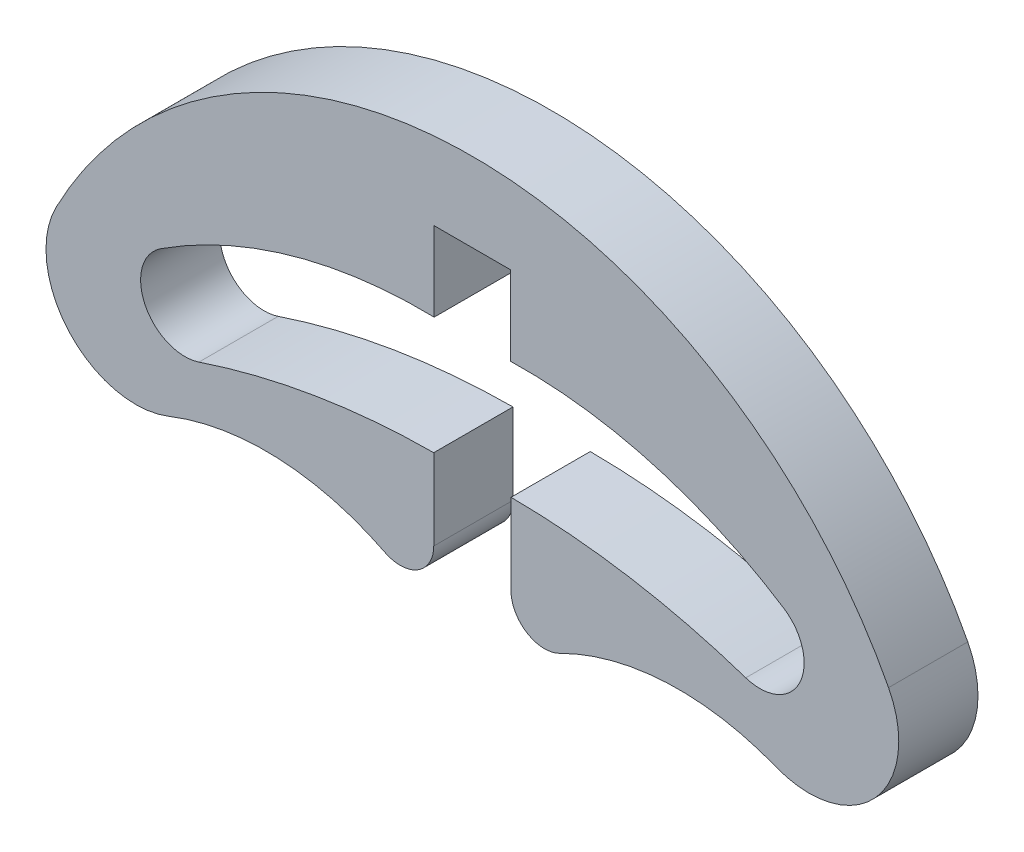
ISO-10303-21;
HEADER;
FILE_DESCRIPTION(('STEP AP214'),'2;1');
FILE_NAME('part.step','',(''),(''),'','','');
FILE_SCHEMA(('AUTOMOTIVE_DESIGN { 1 0 10303 214 1 1 1 1 }'));
ENDSEC;
DATA;
#1=APPLICATION_CONTEXT('core data for automotive mechanical design processes');
#2=APPLICATION_PROTOCOL_DEFINITION('international standard','automotive_design',2000,#1);
#3=PRODUCT_CONTEXT('',#1,'mechanical');
#4=PRODUCT('Part','Part','',(#3));
#5=PRODUCT_RELATED_PRODUCT_CATEGORY('part','',(#4));
#6=PRODUCT_DEFINITION_FORMATION('','',#4);
#7=PRODUCT_DEFINITION_CONTEXT('part definition',#1,'design');
#8=PRODUCT_DEFINITION('design','',#6,#7);
#9=PRODUCT_DEFINITION_SHAPE('','',#8);
#10=(LENGTH_UNIT() NAMED_UNIT(*) SI_UNIT(.MILLI.,.METRE.));
#11=(NAMED_UNIT(*) PLANE_ANGLE_UNIT() SI_UNIT($,.RADIAN.));
#12=(NAMED_UNIT(*) SI_UNIT($,.STERADIAN.) SOLID_ANGLE_UNIT());
#13=UNCERTAINTY_MEASURE_WITH_UNIT(LENGTH_MEASURE(1.E-05),#10,'distance_accuracy_value','');
#14=(GEOMETRIC_REPRESENTATION_CONTEXT(3) GLOBAL_UNCERTAINTY_ASSIGNED_CONTEXT((#13)) GLOBAL_UNIT_ASSIGNED_CONTEXT((#10,
#11,#12)) REPRESENTATION_CONTEXT('',''));
#15=CARTESIAN_POINT('',(0.,0.,0.));
#16=DIRECTION('',(0.,0.,1.));
#17=DIRECTION('',(1.,0.,0.));
#18=AXIS2_PLACEMENT_3D('',#15,#16,#17);
#19=CARTESIAN_POINT('',(1.4475,2.128,3.));
#20=DIRECTION('',(1.,0.,0.));
#21=DIRECTION('',(0.,0.,-1.));
#22=AXIS2_PLACEMENT_3D('',#19,#20,#21);
#23=PLANE('',#22);
#24=DIRECTION('',(0.,-1.,0.));
#25=VECTOR('',#24,1.);
#26=CARTESIAN_POINT('',(1.4475,2.128,0.));
#27=LINE('',#26,#25);
#28=CARTESIAN_POINT('',(1.4475,5.128,0.));
#29=VERTEX_POINT('',#28);
#30=CARTESIAN_POINT('',(1.4475,2.128,0.));
#31=VERTEX_POINT('',#30);
#32=EDGE_CURVE('E296',#29,#31,#27,.T.);
#33=ORIENTED_EDGE('',*,*,#32,.T.);
#34=DIRECTION('',(0.,0.,-1.));
#35=VECTOR('',#34,1.);
#36=CARTESIAN_POINT('',(1.4475,2.128,3.));
#37=LINE('',#36,#35);
#38=CARTESIAN_POINT('',(1.4475,2.128,3.));
#39=VERTEX_POINT('',#38);
#40=EDGE_CURVE('E185',#39,#31,#37,.T.);
#41=ORIENTED_EDGE('',*,*,#40,.F.);
#42=DIRECTION('',(0.,-1.,0.));
#43=VECTOR('',#42,1.);
#44=CARTESIAN_POINT('',(1.4475,2.128,3.));
#45=LINE('',#44,#43);
#46=CARTESIAN_POINT('',(1.4475,5.128,3.));
#47=VERTEX_POINT('',#46);
#48=EDGE_CURVE('E215',#47,#39,#45,.T.);
#49=ORIENTED_EDGE('',*,*,#48,.F.);
#50=DIRECTION('',(0.,0.,-1.));
#51=VECTOR('',#50,1.);
#52=CARTESIAN_POINT('',(1.4475,5.128,3.));
#53=LINE('',#52,#51);
#54=EDGE_CURVE('E214',#47,#29,#53,.T.);
#55=ORIENTED_EDGE('',*,*,#54,.T.);
#56=EDGE_LOOP('',(#33,#41,#49,#55));
#57=FACE_BOUND('',#56,.T.);
#58=ADVANCED_FACE('F48',(#57),#23,.F.);
#59=CARTESIAN_POINT('',(1.88377801092289,-16.0788129173373,3.));
#60=DIRECTION('',(0.,0.,-1.));
#61=DIRECTION('',(-1.,0.,0.));
#62=AXIS2_PLACEMENT_3D('',#59,#60,#61);
#63=CYLINDRICAL_SURFACE('',#62,18.2120392902534);
#64=CARTESIAN_POINT('',(1.88377801092289,-16.0788129173373,0.));
#65=DIRECTION('',(0.,0.,-1.));
#66=DIRECTION('',(-1.,0.,0.));
#67=AXIS2_PLACEMENT_3D('',#64,#65,#66);
#68=CIRCLE('',#67,18.2120392902534);
#69=CARTESIAN_POINT('',(11.7968695966124,-0.801084345214188,0.));
#70=VERTEX_POINT('',#69);
#71=EDGE_CURVE('E325',#31,#70,#68,.T.);
#72=ORIENTED_EDGE('',*,*,#71,.T.);
#73=DIRECTION('',(0.,0.,-1.));
#74=VECTOR('',#73,1.);
#75=CARTESIAN_POINT('',(11.7968695966124,-0.801084345214188,3.));
#76=LINE('',#75,#74);
#77=CARTESIAN_POINT('',(11.7968695966124,-0.801084345214188,3.));
#78=VERTEX_POINT('',#77);
#79=EDGE_CURVE('E243',#78,#70,#76,.T.);
#80=ORIENTED_EDGE('',*,*,#79,.F.);
#81=CARTESIAN_POINT('',(1.88377801092289,-16.0788129173373,3.));
#82=DIRECTION('',(0.,0.,-1.));
#83=DIRECTION('',(-1.,0.,0.));
#84=AXIS2_PLACEMENT_3D('',#81,#82,#83);
#85=CIRCLE('',#84,18.2120392902534);
#86=EDGE_CURVE('E305',#39,#78,#85,.T.);
#87=ORIENTED_EDGE('',*,*,#86,.F.);
#88=ORIENTED_EDGE('',*,*,#40,.T.);
#89=EDGE_LOOP('',(#72,#80,#87,#88));
#90=FACE_BOUND('',#89,.T.);
#91=ADVANCED_FACE('F322',(#90),#63,.F.);
#92=CARTESIAN_POINT('',(10.8843878252639,-2.20737104287746,3.));
#93=DIRECTION('',(0.,0.,-1.));
#94=DIRECTION('',(-1.,0.,0.));
#95=AXIS2_PLACEMENT_3D('',#92,#93,#94);
#96=CYLINDRICAL_SURFACE('',#95,1.6763845797036);
#97=CARTESIAN_POINT('',(10.8843878252639,-2.20737104287746,0.));
#98=DIRECTION('',(0.,0.,-1.));
#99=DIRECTION('',(-1.,0.,0.));
#100=AXIS2_PLACEMENT_3D('',#97,#98,#99);
#101=CIRCLE('',#100,1.6763845797036);
#102=CARTESIAN_POINT('',(10.3516059251626,-3.79683910043397,0.));
#103=VERTEX_POINT('',#102);
#104=EDGE_CURVE('E330',#70,#103,#101,.T.);
#105=ORIENTED_EDGE('',*,*,#104,.T.);
#106=DIRECTION('',(0.,0.,-1.));
#107=VECTOR('',#106,1.);
#108=CARTESIAN_POINT('',(10.3516059251626,-3.79683910043397,3.));
#109=LINE('',#108,#107);
#110=CARTESIAN_POINT('',(10.3516059251626,-3.79683910043397,3.));
#111=VERTEX_POINT('',#110);
#112=EDGE_CURVE('E239',#111,#103,#109,.T.);
#113=ORIENTED_EDGE('',*,*,#112,.F.);
#114=CARTESIAN_POINT('',(10.8843878252639,-2.20737104287746,3.));
#115=DIRECTION('',(0.,0.,-1.));
#116=DIRECTION('',(-1.,0.,0.));
#117=AXIS2_PLACEMENT_3D('',#114,#115,#116);
#118=CIRCLE('',#117,1.6763845797036);
#119=EDGE_CURVE('E309',#78,#111,#118,.T.);
#120=ORIENTED_EDGE('',*,*,#119,.F.);
#121=ORIENTED_EDGE('',*,*,#79,.T.);
#122=EDGE_LOOP('',(#105,#113,#120,#121));
#123=FACE_BOUND('',#122,.T.);
#124=ADVANCED_FACE('F323',(#123),#96,.F.);
#125=CARTESIAN_POINT('',(1.31160144117613,-30.7662206892842,3.));
#126=DIRECTION('',(0.,0.,-1.));
#127=DIRECTION('',(-1.,0.,0.));
#128=AXIS2_PLACEMENT_3D('',#125,#126,#127);
#129=CYLINDRICAL_SURFACE('',#128,28.4441421799904);
#130=CARTESIAN_POINT('',(1.31160144117613,-30.7662206892842,0.));
#131=DIRECTION('',(0.,0.,1.));
#132=DIRECTION('',(1.,0.,0.));
#133=AXIS2_PLACEMENT_3D('',#130,#131,#132);
#134=CIRCLE('',#133,28.4441421799904);
#135=CARTESIAN_POINT('',(1.4625,-2.32247877686251,0.));
#136=VERTEX_POINT('',#135);
#137=EDGE_CURVE('E365',#103,#136,#134,.T.);
#138=ORIENTED_EDGE('',*,*,#137,.T.);
#139=DIRECTION('',(0.,0.,-1.));
#140=VECTOR('',#139,1.);
#141=CARTESIAN_POINT('',(1.4625,-2.32247877686251,3.));
#142=LINE('',#141,#140);
#143=CARTESIAN_POINT('',(1.4625,-2.32247877686251,3.));
#144=VERTEX_POINT('',#143);
#145=EDGE_CURVE('E192',#136,#144,#142,.F.);
#146=ORIENTED_EDGE('',*,*,#145,.T.);
#147=CARTESIAN_POINT('',(1.31160144117613,-30.7662206892842,3.));
#148=DIRECTION('',(0.,0.,1.));
#149=DIRECTION('',(1.,0.,0.));
#150=AXIS2_PLACEMENT_3D('',#147,#148,#149);
#151=CIRCLE('',#150,28.4441421799904);
#152=EDGE_CURVE('E266',#111,#144,#151,.T.);
#153=ORIENTED_EDGE('',*,*,#152,.F.);
#154=ORIENTED_EDGE('',*,*,#112,.T.);
#155=EDGE_LOOP('',(#138,#146,#153,#154));
#156=FACE_BOUND('',#155,.T.);
#157=ADVANCED_FACE('F333',(#156),#129,.T.);
#158=CARTESIAN_POINT('',(7.81556828426179,-15.4545559716848,3.));
#159=DIRECTION('',(0.,0.,-1.));
#160=DIRECTION('',(-1.,0.,0.));
#161=AXIS2_PLACEMENT_3D('',#158,#159,#160);
#162=CYLINDRICAL_SURFACE('',#161,10.0102465106841);
#163=CARTESIAN_POINT('',(7.81556828426179,-15.4545559716848,3.));
#164=DIRECTION('',(0.,0.,-1.));
#165=DIRECTION('',(1.,0.,0.));
#166=AXIS2_PLACEMENT_3D('',#163,#164,#165);
#167=CIRCLE('',#166,10.0102465106841);
#168=CARTESIAN_POINT('',(3.3047833020447,-6.51823379481208,3.));
#169=VERTEX_POINT('',#168);
#170=CARTESIAN_POINT('',(11.4981830857403,-6.1463132036542,3.));
#171=VERTEX_POINT('',#170);
#172=EDGE_CURVE('E268',#169,#171,#167,.T.);
#173=ORIENTED_EDGE('',*,*,#172,.F.);
#174=DIRECTION('',(0.,0.,-1.));
#175=VECTOR('',#174,1.);
#176=CARTESIAN_POINT('',(3.3047833020447,-6.51823379481207,3.));
#177=LINE('',#176,#175);
#178=CARTESIAN_POINT('',(3.3047833020447,-6.51823379481208,0.));
#179=VERTEX_POINT('',#178);
#180=EDGE_CURVE('E57',#169,#179,#177,.T.);
#181=ORIENTED_EDGE('',*,*,#180,.T.);
#182=CARTESIAN_POINT('',(7.81556828426179,-15.4545559716848,0.));
#183=DIRECTION('',(0.,0.,-1.));
#184=DIRECTION('',(1.,0.,0.));
#185=AXIS2_PLACEMENT_3D('',#182,#183,#184);
#186=CIRCLE('',#185,10.0102465106841);
#187=CARTESIAN_POINT('',(11.4981830857403,-6.1463132036542,0.));
#188=VERTEX_POINT('',#187);
#189=EDGE_CURVE('E359',#179,#188,#186,.T.);
#190=ORIENTED_EDGE('',*,*,#189,.T.);
#191=DIRECTION('',(0.,0.,-1.));
#192=VECTOR('',#191,1.);
#193=CARTESIAN_POINT('',(11.4981830857403,-6.1463132036542,3.));
#194=LINE('',#193,#192);
#195=EDGE_CURVE('E240',#171,#188,#194,.T.);
#196=ORIENTED_EDGE('',*,*,#195,.F.);
#197=EDGE_LOOP('',(#173,#181,#190,#196));
#198=FACE_BOUND('',#197,.T.);
#199=ADVANCED_FACE('F419',(#198),#162,.F.);
#200=CARTESIAN_POINT('',(12.7473489068736,-2.98889942365009,3.));
#201=DIRECTION('',(0.,0.,-1.));
#202=DIRECTION('',(-1.,0.,0.));
#203=AXIS2_PLACEMENT_3D('',#200,#201,#202);
#204=CYLINDRICAL_SURFACE('',#203,3.39553781113501);
#205=CARTESIAN_POINT('',(12.7473489068736,-2.98889942365009,0.));
#206=DIRECTION('',(0.,0.,1.));
#207=DIRECTION('',(-1.,0.,0.));
#208=AXIS2_PLACEMENT_3D('',#205,#206,#207);
#209=CIRCLE('',#208,3.39553781113501);
#210=CARTESIAN_POINT('',(15.7567200663857,-1.41620674828577,0.));
#211=VERTEX_POINT('',#210);
#212=EDGE_CURVE('E351',#188,#211,#209,.T.);
#213=ORIENTED_EDGE('',*,*,#212,.T.);
#214=DIRECTION('',(0.,0.,-1.));
#215=VECTOR('',#214,1.);
#216=CARTESIAN_POINT('',(15.7567200663857,-1.41620674828577,3.));
#217=LINE('',#216,#215);
#218=CARTESIAN_POINT('',(15.7567200663857,-1.41620674828577,3.));
#219=VERTEX_POINT('',#218);
#220=EDGE_CURVE('E234',#219,#211,#217,.T.);
#221=ORIENTED_EDGE('',*,*,#220,.F.);
#222=CARTESIAN_POINT('',(12.7473489068736,-2.98889942365009,3.));
#223=DIRECTION('',(0.,0.,1.));
#224=DIRECTION('',(-1.,0.,0.));
#225=AXIS2_PLACEMENT_3D('',#222,#223,#224);
#226=CIRCLE('',#225,3.39553781113501);
#227=EDGE_CURVE('E270',#171,#219,#226,.T.);
#228=ORIENTED_EDGE('',*,*,#227,.F.);
#229=ORIENTED_EDGE('',*,*,#195,.T.);
#230=EDGE_LOOP('',(#213,#221,#228,#229));
#231=FACE_BOUND('',#230,.T.);
#232=ADVANCED_FACE('F416',(#231),#204,.T.);
#233=CARTESIAN_POINT('',(0.,-9.65064408508431,3.));
#234=DIRECTION('',(0.,0.,-1.));
#235=DIRECTION('',(-1.,0.,0.));
#236=AXIS2_PLACEMENT_3D('',#233,#234,#235);
#237=CYLINDRICAL_SURFACE('',#236,17.7786440850843);
#238=CARTESIAN_POINT('',(0.,-9.65064408508431,0.));
#239=DIRECTION('',(0.,0.,1.));
#240=DIRECTION('',(1.,0.,0.));
#241=AXIS2_PLACEMENT_3D('',#238,#239,#240);
#242=CIRCLE('',#241,17.7786440850843);
#243=CARTESIAN_POINT('',(-15.7567200663857,-1.41620674828577,0.));
#244=VERTEX_POINT('',#243);
#245=EDGE_CURVE('E355',#211,#244,#242,.T.);
#246=ORIENTED_EDGE('',*,*,#245,.T.);
#247=DIRECTION('',(0.,0.,-1.));
#248=VECTOR('',#247,1.);
#249=CARTESIAN_POINT('',(-15.7567200663857,-1.41620674828577,3.));
#250=LINE('',#249,#248);
#251=CARTESIAN_POINT('',(-15.7567200663857,-1.41620674828577,3.));
#252=VERTEX_POINT('',#251);
#253=EDGE_CURVE('E233',#252,#244,#250,.T.);
#254=ORIENTED_EDGE('',*,*,#253,.F.);
#255=CARTESIAN_POINT('',(0.,-9.65064408508431,3.));
#256=DIRECTION('',(0.,0.,1.));
#257=DIRECTION('',(-1.,0.,0.));
#258=AXIS2_PLACEMENT_3D('',#255,#256,#257);
#259=CIRCLE('',#258,17.7786440850843);
#260=EDGE_CURVE('E273',#219,#252,#259,.T.);
#261=ORIENTED_EDGE('',*,*,#260,.F.);
#262=ORIENTED_EDGE('',*,*,#220,.T.);
#263=EDGE_LOOP('',(#246,#254,#261,#262));
#264=FACE_BOUND('',#263,.T.);
#265=ADVANCED_FACE('F421',(#264),#237,.T.);
#266=CARTESIAN_POINT('',(-12.7473489068736,-2.98889942365009,3.));
#267=DIRECTION('',(0.,0.,-1.));
#268=DIRECTION('',(-1.,0.,0.));
#269=AXIS2_PLACEMENT_3D('',#266,#267,#268);
#270=CYLINDRICAL_SURFACE('',#269,3.39553781113501);
#271=CARTESIAN_POINT('',(-12.7473489068736,-2.98889942365009,0.));
#272=DIRECTION('',(0.,0.,1.));
#273=DIRECTION('',(1.,0.,0.));
#274=AXIS2_PLACEMENT_3D('',#271,#272,#273);
#275=CIRCLE('',#274,3.39553781113501);
#276=CARTESIAN_POINT('',(-11.4981830857403,-6.1463132036542,0.));
#277=VERTEX_POINT('',#276);
#278=EDGE_CURVE('E202',#244,#277,#275,.T.);
#279=ORIENTED_EDGE('',*,*,#278,.T.);
#280=DIRECTION('',(0.,0.,-1.));
#281=VECTOR('',#280,1.);
#282=CARTESIAN_POINT('',(-11.4981830857403,-6.1463132036542,3.));
#283=LINE('',#282,#281);
#284=CARTESIAN_POINT('',(-11.4981830857403,-6.1463132036542,3.));
#285=VERTEX_POINT('',#284);
#286=EDGE_CURVE('E226',#285,#277,#283,.T.);
#287=ORIENTED_EDGE('',*,*,#286,.F.);
#288=CARTESIAN_POINT('',(-12.7473489068736,-2.98889942365009,3.));
#289=DIRECTION('',(0.,0.,1.));
#290=DIRECTION('',(1.,0.,0.));
#291=AXIS2_PLACEMENT_3D('',#288,#289,#290);
#292=CIRCLE('',#291,3.39553781113501);
#293=EDGE_CURVE('E280',#252,#285,#292,.T.);
#294=ORIENTED_EDGE('',*,*,#293,.F.);
#295=ORIENTED_EDGE('',*,*,#253,.T.);
#296=EDGE_LOOP('',(#279,#287,#294,#295));
#297=FACE_BOUND('',#296,.T.);
#298=ADVANCED_FACE('F354',(#297),#270,.T.);
#299=CARTESIAN_POINT('',(-7.81556828426179,-15.4545559716848,3.));
#300=DIRECTION('',(0.,0.,-1.));
#301=DIRECTION('',(-1.,0.,0.));
#302=AXIS2_PLACEMENT_3D('',#299,#300,#301);
#303=CYLINDRICAL_SURFACE('',#302,10.0102465106841);
#304=CARTESIAN_POINT('',(-7.81556828426179,-15.4545559716848,0.));
#305=DIRECTION('',(0.,0.,-1.));
#306=DIRECTION('',(-1.,0.,0.));
#307=AXIS2_PLACEMENT_3D('',#304,#305,#306);
#308=CIRCLE('',#307,10.0102465106841);
#309=CARTESIAN_POINT('',(-3.3047833020447,-6.51823379481208,0.));
#310=VERTEX_POINT('',#309);
#311=EDGE_CURVE('E198',#277,#310,#308,.T.);
#312=ORIENTED_EDGE('',*,*,#311,.T.);
#313=DIRECTION('',(0.,0.,-1.));
#314=VECTOR('',#313,1.);
#315=CARTESIAN_POINT('',(-3.3047833020447,-6.51823379481207,3.));
#316=LINE('',#315,#314);
#317=CARTESIAN_POINT('',(-3.3047833020447,-6.51823379481208,3.));
#318=VERTEX_POINT('',#317);
#319=EDGE_CURVE('E248',#310,#318,#316,.F.);
#320=ORIENTED_EDGE('',*,*,#319,.T.);
#321=CARTESIAN_POINT('',(-7.81556828426179,-15.4545559716848,3.));
#322=DIRECTION('',(0.,0.,-1.));
#323=DIRECTION('',(-1.,0.,0.));
#324=AXIS2_PLACEMENT_3D('',#321,#322,#323);
#325=CIRCLE('',#324,10.0102465106841);
#326=EDGE_CURVE('E278',#285,#318,#325,.T.);
#327=ORIENTED_EDGE('',*,*,#326,.F.);
#328=ORIENTED_EDGE('',*,*,#286,.T.);
#329=EDGE_LOOP('',(#312,#320,#327,#328));
#330=FACE_BOUND('',#329,.T.);
#331=ADVANCED_FACE('F348',(#330),#303,.F.);
#332=CARTESIAN_POINT('',(-1.31160144117613,-30.7662206892842,3.));
#333=DIRECTION('',(0.,0.,-1.));
#334=DIRECTION('',(-1.,0.,0.));
#335=AXIS2_PLACEMENT_3D('',#332,#333,#334);
#336=CYLINDRICAL_SURFACE('',#335,28.4441421799904);
#337=CARTESIAN_POINT('',(-1.31160144117613,-30.7662206892842,3.));
#338=DIRECTION('',(0.,0.,1.));
#339=DIRECTION('',(-1.,0.,0.));
#340=AXIS2_PLACEMENT_3D('',#337,#338,#339);
#341=CIRCLE('',#340,28.4441421799904);
#342=CARTESIAN_POINT('',(-1.4625,-2.32247877686251,3.));
#343=VERTEX_POINT('',#342);
#344=CARTESIAN_POINT('',(-10.3516059251626,-3.79683910043397,3.));
#345=VERTEX_POINT('',#344);
#346=EDGE_CURVE('E188',#343,#345,#341,.T.);
#347=ORIENTED_EDGE('',*,*,#346,.F.);
#348=DIRECTION('',(0.,0.,-1.));
#349=VECTOR('',#348,1.);
#350=CARTESIAN_POINT('',(-1.4625,-2.32247877686251,3.));
#351=LINE('',#350,#349);
#352=CARTESIAN_POINT('',(-1.4625,-2.32247877686251,0.));
#353=VERTEX_POINT('',#352);
#354=EDGE_CURVE('E174',#343,#353,#351,.T.);
#355=ORIENTED_EDGE('',*,*,#354,.T.);
#356=CARTESIAN_POINT('',(-1.31160144117613,-30.7662206892842,0.));
#357=DIRECTION('',(0.,0.,1.));
#358=DIRECTION('',(-1.,0.,0.));
#359=AXIS2_PLACEMENT_3D('',#356,#357,#358);
#360=CIRCLE('',#359,28.4441421799904);
#361=CARTESIAN_POINT('',(-10.3516059251626,-3.79683910043397,0.));
#362=VERTEX_POINT('',#361);
#363=EDGE_CURVE('E189',#353,#362,#360,.T.);
#364=ORIENTED_EDGE('',*,*,#363,.T.);
#365=DIRECTION('',(0.,0.,-1.));
#366=VECTOR('',#365,1.);
#367=CARTESIAN_POINT('',(-10.3516059251626,-3.79683910043397,3.));
#368=LINE('',#367,#366);
#369=EDGE_CURVE('E228',#345,#362,#368,.T.);
#370=ORIENTED_EDGE('',*,*,#369,.F.);
#371=EDGE_LOOP('',(#347,#355,#364,#370));
#372=FACE_BOUND('',#371,.T.);
#373=ADVANCED_FACE('F187',(#372),#336,.T.);
#374=CARTESIAN_POINT('',(-10.8843878252639,-2.20737104287746,3.));
#375=DIRECTION('',(0.,0.,-1.));
#376=DIRECTION('',(-1.,0.,0.));
#377=AXIS2_PLACEMENT_3D('',#374,#375,#376);
#378=CYLINDRICAL_SURFACE('',#377,1.6763845797036);
#379=CARTESIAN_POINT('',(-10.8843878252639,-2.20737104287746,0.));
#380=DIRECTION('',(0.,0.,-1.));
#381=DIRECTION('',(1.,0.,0.));
#382=AXIS2_PLACEMENT_3D('',#379,#380,#381);
#383=CIRCLE('',#382,1.6763845797036);
#384=CARTESIAN_POINT('',(-11.7968695966124,-0.801084345214188,0.));
#385=VERTEX_POINT('',#384);
#386=EDGE_CURVE('E200',#362,#385,#383,.T.);
#387=ORIENTED_EDGE('',*,*,#386,.T.);
#388=DIRECTION('',(0.,0.,-1.));
#389=VECTOR('',#388,1.);
#390=CARTESIAN_POINT('',(-11.7968695966124,-0.801084345214188,3.));
#391=LINE('',#390,#389);
#392=CARTESIAN_POINT('',(-11.7968695966124,-0.801084345214188,3.));
#393=VERTEX_POINT('',#392);
#394=EDGE_CURVE('E222',#393,#385,#391,.T.);
#395=ORIENTED_EDGE('',*,*,#394,.F.);
#396=CARTESIAN_POINT('',(-10.8843878252639,-2.20737104287746,3.));
#397=DIRECTION('',(0.,0.,-1.));
#398=DIRECTION('',(1.,0.,0.));
#399=AXIS2_PLACEMENT_3D('',#396,#397,#398);
#400=CIRCLE('',#399,1.6763845797036);
#401=EDGE_CURVE('E374',#345,#393,#400,.T.);
#402=ORIENTED_EDGE('',*,*,#401,.F.);
#403=ORIENTED_EDGE('',*,*,#369,.T.);
#404=EDGE_LOOP('',(#387,#395,#402,#403));
#405=FACE_BOUND('',#404,.T.);
#406=ADVANCED_FACE('F379',(#405),#378,.F.);
#407=CARTESIAN_POINT('',(-1.88377801092289,-16.0788129173372,3.));
#408=DIRECTION('',(0.,0.,-1.));
#409=DIRECTION('',(-1.,0.,0.));
#410=AXIS2_PLACEMENT_3D('',#407,#408,#409);
#411=CYLINDRICAL_SURFACE('',#410,18.2120392902534);
#412=CARTESIAN_POINT('',(-1.88377801092289,-16.0788129173372,0.));
#413=DIRECTION('',(0.,0.,-1.));
#414=DIRECTION('',(1.,0.,0.));
#415=AXIS2_PLACEMENT_3D('',#412,#413,#414);
#416=CIRCLE('',#415,18.2120392902534);
#417=CARTESIAN_POINT('',(-1.4475,2.128,0.));
#418=VERTEX_POINT('',#417);
#419=EDGE_CURVE('E199',#385,#418,#416,.T.);
#420=ORIENTED_EDGE('',*,*,#419,.T.);
#421=DIRECTION('',(0.,0.,-1.));
#422=VECTOR('',#421,1.);
#423=CARTESIAN_POINT('',(-1.4475,2.128,3.));
#424=LINE('',#423,#422);
#425=CARTESIAN_POINT('',(-1.4475,2.128,3.));
#426=VERTEX_POINT('',#425);
#427=EDGE_CURVE('E219',#426,#418,#424,.T.);
#428=ORIENTED_EDGE('',*,*,#427,.F.);
#429=CARTESIAN_POINT('',(-1.88377801092289,-16.0788129173372,3.));
#430=DIRECTION('',(0.,0.,-1.));
#431=DIRECTION('',(1.,0.,0.));
#432=AXIS2_PLACEMENT_3D('',#429,#430,#431);
#433=CIRCLE('',#432,18.2120392902534);
#434=EDGE_CURVE('E375',#393,#426,#433,.T.);
#435=ORIENTED_EDGE('',*,*,#434,.F.);
#436=ORIENTED_EDGE('',*,*,#394,.T.);
#437=EDGE_LOOP('',(#420,#428,#435,#436));
#438=FACE_BOUND('',#437,.T.);
#439=ADVANCED_FACE('F381',(#438),#411,.F.);
#440=CARTESIAN_POINT('',(-1.4475,2.128,3.));
#441=DIRECTION('',(-1.,0.,0.));
#442=DIRECTION('',(0.,0.,1.));
#443=AXIS2_PLACEMENT_3D('',#440,#441,#442);
#444=PLANE('',#443);
#445=DIRECTION('',(0.,1.,0.));
#446=VECTOR('',#445,1.);
#447=CARTESIAN_POINT('',(-1.4475,2.128,0.));
#448=LINE('',#447,#446);
#449=CARTESIAN_POINT('',(-1.4475,5.128,0.));
#450=VERTEX_POINT('',#449);
#451=EDGE_CURVE('E206',#418,#450,#448,.T.);
#452=ORIENTED_EDGE('',*,*,#451,.T.);
#453=DIRECTION('',(0.,0.,-1.));
#454=VECTOR('',#453,1.);
#455=CARTESIAN_POINT('',(-1.4475,5.128,3.));
#456=LINE('',#455,#454);
#457=CARTESIAN_POINT('',(-1.4475,5.128,3.));
#458=VERTEX_POINT('',#457);
#459=EDGE_CURVE('E216',#458,#450,#456,.T.);
#460=ORIENTED_EDGE('',*,*,#459,.F.);
#461=DIRECTION('',(0.,1.,0.));
#462=VECTOR('',#461,1.);
#463=CARTESIAN_POINT('',(-1.4475,2.128,3.));
#464=LINE('',#463,#462);
#465=EDGE_CURVE('E367',#426,#458,#464,.T.);
#466=ORIENTED_EDGE('',*,*,#465,.F.);
#467=ORIENTED_EDGE('',*,*,#427,.T.);
#468=EDGE_LOOP('',(#452,#460,#466,#467));
#469=FACE_BOUND('',#468,.T.);
#470=ADVANCED_FACE('F388',(#469),#444,.F.);
#471=CARTESIAN_POINT('',(-1.4475,5.128,3.));
#472=DIRECTION('',(0.,1.,0.));
#473=DIRECTION('',(0.,0.,1.));
#474=AXIS2_PLACEMENT_3D('',#471,#472,#473);
#475=PLANE('',#474);
#476=DIRECTION('',(1.,0.,0.));
#477=VECTOR('',#476,1.);
#478=CARTESIAN_POINT('',(-1.4475,5.128,0.));
#479=LINE('',#478,#477);
#480=EDGE_CURVE('E208',#450,#29,#479,.T.);
#481=ORIENTED_EDGE('',*,*,#480,.T.);
#482=ORIENTED_EDGE('',*,*,#54,.F.);
#483=DIRECTION('',(1.,0.,0.));
#484=VECTOR('',#483,1.);
#485=CARTESIAN_POINT('',(-1.4475,5.128,3.));
#486=LINE('',#485,#484);
#487=EDGE_CURVE('E220',#458,#47,#486,.T.);
#488=ORIENTED_EDGE('',*,*,#487,.F.);
#489=ORIENTED_EDGE('',*,*,#459,.T.);
#490=EDGE_LOOP('',(#481,#482,#488,#489));
#491=FACE_BOUND('',#490,.T.);
#492=ADVANCED_FACE('F392',(#491),#475,.F.);
#493=CARTESIAN_POINT('',(-1.88377801092289,-16.0788129173372,3.));
#494=DIRECTION('',(0.,0.,1.));
#495=DIRECTION('',(1.,0.,0.));
#496=AXIS2_PLACEMENT_3D('',#493,#494,#495);
#497=PLANE('',#496);
#498=ORIENTED_EDGE('',*,*,#326,.T.);
#499=CARTESIAN_POINT('',(-2.7325,-5.38448257774511,3.));
#500=DIRECTION('',(0.,0.,1.));
#501=DIRECTION('',(1.,0.,0.));
#502=AXIS2_PLACEMENT_3D('',#499,#500,#501);
#503=CIRCLE('',#502,1.27);
#504=CARTESIAN_POINT('',(-1.4625,-5.38448257774511,3.));
#505=VERTEX_POINT('',#504);
#506=EDGE_CURVE('E253',#318,#505,#503,.T.);
#507=ORIENTED_EDGE('',*,*,#506,.T.);
#508=DIRECTION('',(0.,-1.,0.));
#509=VECTOR('',#508,1.);
#510=CARTESIAN_POINT('',(-1.4625,-9.26231250870832,3.));
#511=LINE('',#510,#509);
#512=EDGE_CURVE('E195',#343,#505,#511,.T.);
#513=ORIENTED_EDGE('',*,*,#512,.F.);
#514=ORIENTED_EDGE('',*,*,#346,.T.);
#515=ORIENTED_EDGE('',*,*,#401,.T.);
#516=ORIENTED_EDGE('',*,*,#434,.T.);
#517=ORIENTED_EDGE('',*,*,#465,.T.);
#518=ORIENTED_EDGE('',*,*,#487,.T.);
#519=ORIENTED_EDGE('',*,*,#48,.T.);
#520=ORIENTED_EDGE('',*,*,#86,.T.);
#521=ORIENTED_EDGE('',*,*,#119,.T.);
#522=ORIENTED_EDGE('',*,*,#152,.T.);
#523=DIRECTION('',(0.,1.,0.));
#524=VECTOR('',#523,1.);
#525=CARTESIAN_POINT('',(1.4625,-9.26231250870832,3.));
#526=LINE('',#525,#524);
#527=CARTESIAN_POINT('',(1.4625,-5.38448257774511,3.));
#528=VERTEX_POINT('',#527);
#529=EDGE_CURVE('E291',#528,#144,#526,.T.);
#530=ORIENTED_EDGE('',*,*,#529,.F.);
#531=CARTESIAN_POINT('',(2.7325,-5.38448257774511,3.));
#532=DIRECTION('',(0.,0.,1.));
#533=DIRECTION('',(1.,0.,0.));
#534=AXIS2_PLACEMENT_3D('',#531,#532,#533);
#535=CIRCLE('',#534,1.27);
#536=EDGE_CURVE('E255',#528,#169,#535,.T.);
#537=ORIENTED_EDGE('',*,*,#536,.T.);
#538=ORIENTED_EDGE('',*,*,#172,.T.);
#539=ORIENTED_EDGE('',*,*,#227,.T.);
#540=ORIENTED_EDGE('',*,*,#260,.T.);
#541=ORIENTED_EDGE('',*,*,#293,.T.);
#542=EDGE_LOOP('',(#498,#507,#513,#514,#515,#516,#517,#518,#519,#520,#521,#522,#530,#537,#538,
#539,#540,#541));
#543=FACE_BOUND('',#542,.T.);
#544=ADVANCED_FACE('F320',(#543),#497,.T.);
#545=CARTESIAN_POINT('',(-1.88377801092289,-16.0788129173372,0.));
#546=DIRECTION('',(0.,0.,1.));
#547=DIRECTION('',(1.,0.,0.));
#548=AXIS2_PLACEMENT_3D('',#545,#546,#547);
#549=PLANE('',#548);
#550=DIRECTION('',(0.,-1.,0.));
#551=VECTOR('',#550,1.);
#552=CARTESIAN_POINT('',(-1.4625,-16.0788129173372,0.));
#553=LINE('',#552,#551);
#554=CARTESIAN_POINT('',(-1.4625,-5.38448257774511,0.));
#555=VERTEX_POINT('',#554);
#556=EDGE_CURVE('E171',#353,#555,#553,.T.);
#557=ORIENTED_EDGE('',*,*,#556,.T.);
#558=CARTESIAN_POINT('',(-2.7325,-5.38448257774511,0.));
#559=DIRECTION('',(0.,0.,1.));
#560=DIRECTION('',(1.,0.,0.));
#561=AXIS2_PLACEMENT_3D('',#558,#559,#560);
#562=CIRCLE('',#561,1.27);
#563=EDGE_CURVE('E336',#555,#310,#562,.F.);
#564=ORIENTED_EDGE('',*,*,#563,.T.);
#565=ORIENTED_EDGE('',*,*,#311,.F.);
#566=ORIENTED_EDGE('',*,*,#278,.F.);
#567=ORIENTED_EDGE('',*,*,#245,.F.);
#568=ORIENTED_EDGE('',*,*,#212,.F.);
#569=ORIENTED_EDGE('',*,*,#189,.F.);
#570=CARTESIAN_POINT('',(2.7325,-5.38448257774511,0.));
#571=DIRECTION('',(0.,0.,1.));
#572=DIRECTION('',(1.,0.,0.));
#573=AXIS2_PLACEMENT_3D('',#570,#571,#572);
#574=CIRCLE('',#573,1.27);
#575=CARTESIAN_POINT('',(1.4625,-5.38448257774511,0.));
#576=VERTEX_POINT('',#575);
#577=EDGE_CURVE('E64',#179,#576,#574,.F.);
#578=ORIENTED_EDGE('',*,*,#577,.T.);
#579=DIRECTION('',(0.,1.,0.));
#580=VECTOR('',#579,1.);
#581=CARTESIAN_POINT('',(1.4625,-16.0788129173372,0.));
#582=LINE('',#581,#580);
#583=EDGE_CURVE('E181',#576,#136,#582,.T.);
#584=ORIENTED_EDGE('',*,*,#583,.T.);
#585=ORIENTED_EDGE('',*,*,#137,.F.);
#586=ORIENTED_EDGE('',*,*,#104,.F.);
#587=ORIENTED_EDGE('',*,*,#71,.F.);
#588=ORIENTED_EDGE('',*,*,#32,.F.);
#589=ORIENTED_EDGE('',*,*,#480,.F.);
#590=ORIENTED_EDGE('',*,*,#451,.F.);
#591=ORIENTED_EDGE('',*,*,#419,.F.);
#592=ORIENTED_EDGE('',*,*,#386,.F.);
#593=ORIENTED_EDGE('',*,*,#363,.F.);
#594=EDGE_LOOP('',(#557,#564,#565,#566,#567,#568,#569,#578,#584,#585,#586,#587,#588,#589,#590,
#591,#592,#593));
#595=FACE_BOUND('',#594,.T.);
#596=ADVANCED_FACE('F193',(#595),#549,.F.);
#597=CARTESIAN_POINT('',(-1.4625,-9.26231250870832,-8.57260781787669));
#598=DIRECTION('',(-1.,0.,0.));
#599=DIRECTION('',(0.,0.,1.));
#600=AXIS2_PLACEMENT_3D('',#597,#598,#599);
#601=PLANE('',#600);
#602=ORIENTED_EDGE('',*,*,#512,.T.);
#603=DIRECTION('',(0.,0.,-1.));
#604=VECTOR('',#603,1.);
#605=CARTESIAN_POINT('',(-1.4625,-5.38448257774511,-8.57260781787669));
#606=LINE('',#605,#604);
#607=EDGE_CURVE('E178',#505,#555,#606,.T.);
#608=ORIENTED_EDGE('',*,*,#607,.T.);
#609=ORIENTED_EDGE('',*,*,#556,.F.);
#610=ORIENTED_EDGE('',*,*,#354,.F.);
#611=EDGE_LOOP('',(#602,#608,#609,#610));
#612=FACE_BOUND('',#611,.T.);
#613=ADVANCED_FACE('F172',(#612),#601,.F.);
#614=CARTESIAN_POINT('',(1.4625,-9.26231250870832,-8.57260781787669));
#615=DIRECTION('',(1.,0.,0.));
#616=DIRECTION('',(0.,0.,-1.));
#617=AXIS2_PLACEMENT_3D('',#614,#615,#616);
#618=PLANE('',#617);
#619=ORIENTED_EDGE('',*,*,#583,.F.);
#620=DIRECTION('',(0.,0.,-1.));
#621=VECTOR('',#620,1.);
#622=CARTESIAN_POINT('',(1.4625,-5.38448257774511,-8.57260781787669));
#623=LINE('',#622,#621);
#624=EDGE_CURVE('E12',#576,#528,#623,.F.);
#625=ORIENTED_EDGE('',*,*,#624,.T.);
#626=ORIENTED_EDGE('',*,*,#529,.T.);
#627=ORIENTED_EDGE('',*,*,#145,.F.);
#628=EDGE_LOOP('',(#619,#625,#626,#627));
#629=FACE_BOUND('',#628,.T.);
#630=ADVANCED_FACE('F399',(#629),#618,.F.);
#631=CARTESIAN_POINT('',(-2.7325,-5.38448257774511,3.));
#632=DIRECTION('',(0.,0.,-1.));
#633=DIRECTION('',(-1.,0.,0.));
#634=AXIS2_PLACEMENT_3D('',#631,#632,#633);
#635=CYLINDRICAL_SURFACE('',#634,1.27);
#636=ORIENTED_EDGE('',*,*,#563,.F.);
#637=ORIENTED_EDGE('',*,*,#607,.F.);
#638=ORIENTED_EDGE('',*,*,#506,.F.);
#639=ORIENTED_EDGE('',*,*,#319,.F.);
#640=EDGE_LOOP('',(#636,#637,#638,#639));
#641=FACE_BOUND('',#640,.T.);
#642=ADVANCED_FACE('F341',(#641),#635,.T.);
#643=CARTESIAN_POINT('',(2.7325,-5.38448257774511,3.));
#644=DIRECTION('',(0.,0.,-1.));
#645=DIRECTION('',(-1.,0.,0.));
#646=AXIS2_PLACEMENT_3D('',#643,#644,#645);
#647=CYLINDRICAL_SURFACE('',#646,1.27);
#648=ORIENTED_EDGE('',*,*,#536,.F.);
#649=ORIENTED_EDGE('',*,*,#624,.F.);
#650=ORIENTED_EDGE('',*,*,#577,.F.);
#651=ORIENTED_EDGE('',*,*,#180,.F.);
#652=EDGE_LOOP('',(#648,#649,#650,#651));
#653=FACE_BOUND('',#652,.T.);
#654=ADVANCED_FACE('F49',(#653),#647,.T.);
#655=CLOSED_SHELL('',(#58,#91,#124,#157,#199,#232,#265,#298,#331,#373,#406,#439,#470,#492,#544,
#596,#613,#630,#642,#654));
#656=MANIFOLD_SOLID_BREP('B2',#655);
#657=ADVANCED_BREP_SHAPE_REPRESENTATION('',(#18,#656),#14);
#658=SHAPE_DEFINITION_REPRESENTATION(#9,#657);
ENDSEC;
END-ISO-10303-21;
